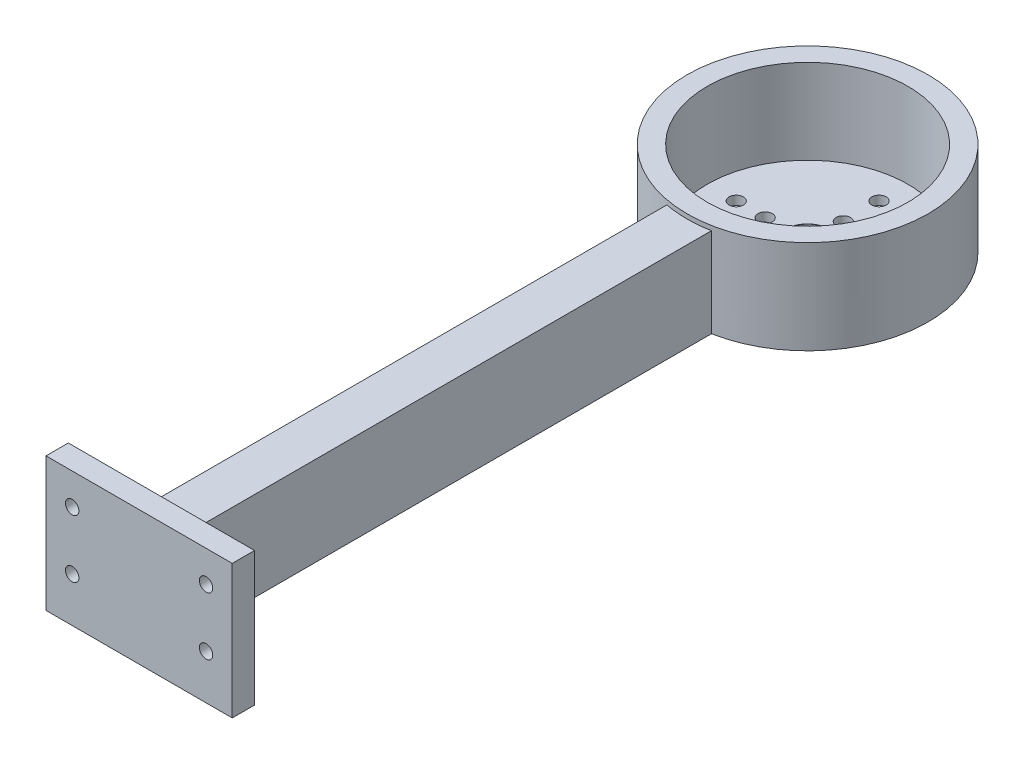
ISO-10303-21;
HEADER;
FILE_DESCRIPTION(('STEP AP214'),'2;1');
FILE_NAME('part.step','',(''),(''),'','','');
FILE_SCHEMA(('AUTOMOTIVE_DESIGN { 1 0 10303 214 1 1 1 1 }'));
ENDSEC;
DATA;
#1=APPLICATION_CONTEXT('core data for automotive mechanical design processes');
#2=APPLICATION_PROTOCOL_DEFINITION('international standard','automotive_design',2000,#1);
#3=PRODUCT_CONTEXT('',#1,'mechanical');
#4=PRODUCT('Part','Part','',(#3));
#5=PRODUCT_RELATED_PRODUCT_CATEGORY('part','',(#4));
#6=PRODUCT_DEFINITION_FORMATION('','',#4);
#7=PRODUCT_DEFINITION_CONTEXT('part definition',#1,'design');
#8=PRODUCT_DEFINITION('design','',#6,#7);
#9=PRODUCT_DEFINITION_SHAPE('','',#8);
#10=(LENGTH_UNIT() NAMED_UNIT(*) SI_UNIT(.MILLI.,.METRE.));
#11=(NAMED_UNIT(*) PLANE_ANGLE_UNIT() SI_UNIT($,.RADIAN.));
#12=(NAMED_UNIT(*) SI_UNIT($,.STERADIAN.) SOLID_ANGLE_UNIT());
#13=UNCERTAINTY_MEASURE_WITH_UNIT(LENGTH_MEASURE(1.E-05),#10,'distance_accuracy_value','');
#14=(GEOMETRIC_REPRESENTATION_CONTEXT(3) GLOBAL_UNCERTAINTY_ASSIGNED_CONTEXT((#13)) GLOBAL_UNIT_ASSIGNED_CONTEXT((#10,
#11,#12)) REPRESENTATION_CONTEXT('',''));
#15=CARTESIAN_POINT('',(0.,0.,0.));
#16=DIRECTION('',(0.,0.,1.));
#17=DIRECTION('',(1.,0.,0.));
#18=AXIS2_PLACEMENT_3D('',#15,#16,#17);
#19=CARTESIAN_POINT('',(0.,0.,0.));
#20=DIRECTION('',(0.,0.,1.));
#21=DIRECTION('',(1.,0.,0.));
#22=AXIS2_PLACEMENT_3D('',#19,#20,#21);
#23=PLANE('',#22);
#24=CARTESIAN_POINT('',(-15.,8.,0.));
#25=DIRECTION('',(0.,0.,-1.));
#26=DIRECTION('',(-1.,0.,0.));
#27=AXIS2_PLACEMENT_3D('',#24,#25,#26);
#28=CIRCLE('',#27,1.525);
#29=CARTESIAN_POINT('',(-16.525,8.,0.));
#30=VERTEX_POINT('',#29);
#31=EDGE_CURVE('E157',#30,#30,#28,.T.);
#32=ORIENTED_EDGE('',*,*,#31,.F.);
#33=EDGE_LOOP('',(#32));
#34=FACE_BOUND('',#33,.T.);
#35=CARTESIAN_POINT('',(15.,8.,0.));
#36=DIRECTION('',(0.,0.,-1.));
#37=DIRECTION('',(-1.,0.,0.));
#38=AXIS2_PLACEMENT_3D('',#35,#36,#37);
#39=CIRCLE('',#38,1.525);
#40=CARTESIAN_POINT('',(13.475,8.,0.));
#41=VERTEX_POINT('',#40);
#42=EDGE_CURVE('E220',#41,#41,#39,.T.);
#43=ORIENTED_EDGE('',*,*,#42,.F.);
#44=EDGE_LOOP('',(#43));
#45=FACE_BOUND('',#44,.T.);
#46=CARTESIAN_POINT('',(-15.,-4.99999999999999,0.));
#47=DIRECTION('',(0.,0.,-1.));
#48=DIRECTION('',(-1.,0.,0.));
#49=AXIS2_PLACEMENT_3D('',#46,#47,#48);
#50=CIRCLE('',#49,1.525);
#51=CARTESIAN_POINT('',(-16.525,-4.99999999999999,0.));
#52=VERTEX_POINT('',#51);
#53=EDGE_CURVE('E229',#52,#52,#50,.T.);
#54=ORIENTED_EDGE('',*,*,#53,.F.);
#55=EDGE_LOOP('',(#54));
#56=FACE_BOUND('',#55,.T.);
#57=CARTESIAN_POINT('',(15.,-5.,0.));
#58=DIRECTION('',(0.,0.,-1.));
#59=DIRECTION('',(-1.,0.,0.));
#60=AXIS2_PLACEMENT_3D('',#57,#58,#59);
#61=CIRCLE('',#60,1.525);
#62=CARTESIAN_POINT('',(13.475,-5.,0.));
#63=VERTEX_POINT('',#62);
#64=EDGE_CURVE('E238',#63,#63,#61,.T.);
#65=ORIENTED_EDGE('',*,*,#64,.F.);
#66=EDGE_LOOP('',(#65));
#67=FACE_BOUND('',#66,.T.);
#68=DIRECTION('',(0.,1.,0.));
#69=VECTOR('',#68,1.);
#70=CARTESIAN_POINT('',(20.865,15.,0.));
#71=LINE('',#70,#69);
#72=CARTESIAN_POINT('',(20.865,-15.,0.));
#73=VERTEX_POINT('',#72);
#74=CARTESIAN_POINT('',(20.865,15.,0.));
#75=VERTEX_POINT('',#74);
#76=EDGE_CURVE('E125',#73,#75,#71,.T.);
#77=ORIENTED_EDGE('',*,*,#76,.F.);
#78=DIRECTION('',(1.,0.,0.));
#79=VECTOR('',#78,1.);
#80=CARTESIAN_POINT('',(-20.865,-15.,0.));
#81=LINE('',#80,#79);
#82=CARTESIAN_POINT('',(-20.865,-15.,0.));
#83=VERTEX_POINT('',#82);
#84=EDGE_CURVE('E130',#83,#73,#81,.T.);
#85=ORIENTED_EDGE('',*,*,#84,.F.);
#86=DIRECTION('',(0.,-1.,0.));
#87=VECTOR('',#86,1.);
#88=CARTESIAN_POINT('',(-20.865,15.,0.));
#89=LINE('',#88,#87);
#90=CARTESIAN_POINT('',(-20.865,15.,0.));
#91=VERTEX_POINT('',#90);
#92=EDGE_CURVE('E141',#91,#83,#89,.T.);
#93=ORIENTED_EDGE('',*,*,#92,.F.);
#94=DIRECTION('',(-1.,0.,0.));
#95=VECTOR('',#94,1.);
#96=CARTESIAN_POINT('',(-20.865,15.,0.));
#97=LINE('',#96,#95);
#98=EDGE_CURVE('E139',#75,#91,#97,.T.);
#99=ORIENTED_EDGE('',*,*,#98,.F.);
#100=EDGE_LOOP('',(#77,#85,#93,#99));
#101=FACE_BOUND('',#100,.T.);
#102=DIRECTION('',(0.,1.,0.));
#103=VECTOR('',#102,1.);
#104=CARTESIAN_POINT('',(-5.,10.,0.));
#105=LINE('',#104,#103);
#106=CARTESIAN_POINT('',(-5.,-10.,0.));
#107=VERTEX_POINT('',#106);
#108=CARTESIAN_POINT('',(-5.,10.,0.));
#109=VERTEX_POINT('',#108);
#110=EDGE_CURVE('E257',#107,#109,#105,.T.);
#111=ORIENTED_EDGE('',*,*,#110,.F.);
#112=DIRECTION('',(-1.,0.,0.));
#113=VECTOR('',#112,1.);
#114=CARTESIAN_POINT('',(5.,-10.,0.));
#115=LINE('',#114,#113);
#116=CARTESIAN_POINT('',(5.,-10.,0.));
#117=VERTEX_POINT('',#116);
#118=EDGE_CURVE('E120',#117,#107,#115,.T.);
#119=ORIENTED_EDGE('',*,*,#118,.F.);
#120=DIRECTION('',(0.,-1.,0.));
#121=VECTOR('',#120,1.);
#122=CARTESIAN_POINT('',(5.,10.,0.));
#123=LINE('',#122,#121);
#124=CARTESIAN_POINT('',(5.,10.,0.));
#125=VERTEX_POINT('',#124);
#126=EDGE_CURVE('E115',#125,#117,#123,.T.);
#127=ORIENTED_EDGE('',*,*,#126,.F.);
#128=DIRECTION('',(1.,0.,0.));
#129=VECTOR('',#128,1.);
#130=CARTESIAN_POINT('',(5.,10.,0.));
#131=LINE('',#130,#129);
#132=EDGE_CURVE('E260',#109,#125,#131,.T.);
#133=ORIENTED_EDGE('',*,*,#132,.F.);
#134=EDGE_LOOP('',(#111,#119,#127,#133));
#135=FACE_BOUND('',#134,.T.);
#136=ADVANCED_FACE('F33',(#34,#45,#56,#67,#101,#135),#23,.F.);
#137=CARTESIAN_POINT('',(20.865,15.,5.));
#138=DIRECTION('',(-1.,0.,0.));
#139=DIRECTION('',(0.,-1.,0.));
#140=AXIS2_PLACEMENT_3D('',#137,#138,#139);
#141=PLANE('',#140);
#142=ORIENTED_EDGE('',*,*,#76,.T.);
#143=DIRECTION('',(0.,0.,-1.));
#144=VECTOR('',#143,1.);
#145=CARTESIAN_POINT('',(20.865,15.,5.));
#146=LINE('',#145,#144);
#147=CARTESIAN_POINT('',(20.865,15.,5.));
#148=VERTEX_POINT('',#147);
#149=EDGE_CURVE('E42',#148,#75,#146,.T.);
#150=ORIENTED_EDGE('',*,*,#149,.F.);
#151=DIRECTION('',(0.,1.,0.));
#152=VECTOR('',#151,1.);
#153=CARTESIAN_POINT('',(20.865,15.,5.));
#154=LINE('',#153,#152);
#155=CARTESIAN_POINT('',(20.865,-15.,5.));
#156=VERTEX_POINT('',#155);
#157=EDGE_CURVE('E126',#156,#148,#154,.T.);
#158=ORIENTED_EDGE('',*,*,#157,.F.);
#159=DIRECTION('',(0.,0.,-1.));
#160=VECTOR('',#159,1.);
#161=CARTESIAN_POINT('',(20.865,-15.,5.));
#162=LINE('',#161,#160);
#163=EDGE_CURVE('E136',#156,#73,#162,.T.);
#164=ORIENTED_EDGE('',*,*,#163,.T.);
#165=EDGE_LOOP('',(#142,#150,#158,#164));
#166=FACE_BOUND('',#165,.T.);
#167=ADVANCED_FACE('F35',(#166),#141,.F.);
#168=CARTESIAN_POINT('',(-20.865,15.,5.));
#169=DIRECTION('',(0.,-1.,0.));
#170=DIRECTION('',(0.,0.,-1.));
#171=AXIS2_PLACEMENT_3D('',#168,#169,#170);
#172=PLANE('',#171);
#173=ORIENTED_EDGE('',*,*,#98,.T.);
#174=DIRECTION('',(0.,0.,-1.));
#175=VECTOR('',#174,1.);
#176=CARTESIAN_POINT('',(-20.865,15.,5.));
#177=LINE('',#176,#175);
#178=CARTESIAN_POINT('',(-20.865,15.,5.));
#179=VERTEX_POINT('',#178);
#180=EDGE_CURVE('E149',#179,#91,#177,.T.);
#181=ORIENTED_EDGE('',*,*,#180,.F.);
#182=DIRECTION('',(-1.,0.,0.));
#183=VECTOR('',#182,1.);
#184=CARTESIAN_POINT('',(-20.865,15.,5.));
#185=LINE('',#184,#183);
#186=EDGE_CURVE('E129',#148,#179,#185,.T.);
#187=ORIENTED_EDGE('',*,*,#186,.F.);
#188=ORIENTED_EDGE('',*,*,#149,.T.);
#189=EDGE_LOOP('',(#173,#181,#187,#188));
#190=FACE_BOUND('',#189,.T.);
#191=ADVANCED_FACE('F284',(#190),#172,.F.);
#192=CARTESIAN_POINT('',(-20.865,15.,5.));
#193=DIRECTION('',(1.,0.,0.));
#194=DIRECTION('',(0.,1.,0.));
#195=AXIS2_PLACEMENT_3D('',#192,#193,#194);
#196=PLANE('',#195);
#197=ORIENTED_EDGE('',*,*,#92,.T.);
#198=DIRECTION('',(0.,0.,-1.));
#199=VECTOR('',#198,1.);
#200=CARTESIAN_POINT('',(-20.865,-15.,5.));
#201=LINE('',#200,#199);
#202=CARTESIAN_POINT('',(-20.865,-15.,5.));
#203=VERTEX_POINT('',#202);
#204=EDGE_CURVE('E146',#203,#83,#201,.T.);
#205=ORIENTED_EDGE('',*,*,#204,.F.);
#206=DIRECTION('',(0.,-1.,0.));
#207=VECTOR('',#206,1.);
#208=CARTESIAN_POINT('',(-20.865,15.,5.));
#209=LINE('',#208,#207);
#210=EDGE_CURVE('E132',#179,#203,#209,.T.);
#211=ORIENTED_EDGE('',*,*,#210,.F.);
#212=ORIENTED_EDGE('',*,*,#180,.T.);
#213=EDGE_LOOP('',(#197,#205,#211,#212));
#214=FACE_BOUND('',#213,.T.);
#215=ADVANCED_FACE('F293',(#214),#196,.F.);
#216=CARTESIAN_POINT('',(-20.865,-15.,5.));
#217=DIRECTION('',(0.,1.,0.));
#218=DIRECTION('',(0.,0.,1.));
#219=AXIS2_PLACEMENT_3D('',#216,#217,#218);
#220=PLANE('',#219);
#221=ORIENTED_EDGE('',*,*,#84,.T.);
#222=ORIENTED_EDGE('',*,*,#163,.F.);
#223=DIRECTION('',(1.,0.,0.));
#224=VECTOR('',#223,1.);
#225=CARTESIAN_POINT('',(-20.865,-15.,5.));
#226=LINE('',#225,#224);
#227=EDGE_CURVE('E134',#203,#156,#226,.T.);
#228=ORIENTED_EDGE('',*,*,#227,.F.);
#229=ORIENTED_EDGE('',*,*,#204,.T.);
#230=EDGE_LOOP('',(#221,#222,#228,#229));
#231=FACE_BOUND('',#230,.T.);
#232=ADVANCED_FACE('F290',(#231),#220,.F.);
#233=CARTESIAN_POINT('',(0.,0.,5.));
#234=DIRECTION('',(0.,0.,1.));
#235=DIRECTION('',(1.,0.,0.));
#236=AXIS2_PLACEMENT_3D('',#233,#234,#235);
#237=PLANE('',#236);
#238=CARTESIAN_POINT('',(-15.,8.,5.));
#239=DIRECTION('',(0.,0.,-1.));
#240=DIRECTION('',(-1.,0.,0.));
#241=AXIS2_PLACEMENT_3D('',#238,#239,#240);
#242=CIRCLE('',#241,1.5);
#243=CARTESIAN_POINT('',(-16.5,8.,5.));
#244=VERTEX_POINT('',#243);
#245=EDGE_CURVE('E217',#244,#244,#242,.T.);
#246=ORIENTED_EDGE('',*,*,#245,.T.);
#247=EDGE_LOOP('',(#246));
#248=FACE_BOUND('',#247,.T.);
#249=CARTESIAN_POINT('',(15.,8.,5.));
#250=DIRECTION('',(0.,0.,-1.));
#251=DIRECTION('',(-1.,0.,0.));
#252=AXIS2_PLACEMENT_3D('',#249,#250,#251);
#253=CIRCLE('',#252,1.5);
#254=CARTESIAN_POINT('',(13.5,8.,5.));
#255=VERTEX_POINT('',#254);
#256=EDGE_CURVE('E226',#255,#255,#253,.T.);
#257=ORIENTED_EDGE('',*,*,#256,.T.);
#258=EDGE_LOOP('',(#257));
#259=FACE_BOUND('',#258,.T.);
#260=CARTESIAN_POINT('',(-15.,-4.99999999999999,5.));
#261=DIRECTION('',(0.,0.,-1.));
#262=DIRECTION('',(-1.,0.,0.));
#263=AXIS2_PLACEMENT_3D('',#260,#261,#262);
#264=CIRCLE('',#263,1.5);
#265=CARTESIAN_POINT('',(-16.5,-4.99999999999999,5.));
#266=VERTEX_POINT('',#265);
#267=EDGE_CURVE('E235',#266,#266,#264,.T.);
#268=ORIENTED_EDGE('',*,*,#267,.T.);
#269=EDGE_LOOP('',(#268));
#270=FACE_BOUND('',#269,.T.);
#271=CARTESIAN_POINT('',(15.,-5.,5.));
#272=DIRECTION('',(0.,0.,-1.));
#273=DIRECTION('',(-1.,0.,0.));
#274=AXIS2_PLACEMENT_3D('',#271,#272,#273);
#275=CIRCLE('',#274,1.5);
#276=CARTESIAN_POINT('',(13.5,-5.,5.));
#277=VERTEX_POINT('',#276);
#278=EDGE_CURVE('E244',#277,#277,#275,.T.);
#279=ORIENTED_EDGE('',*,*,#278,.T.);
#280=EDGE_LOOP('',(#279));
#281=FACE_BOUND('',#280,.T.);
#282=ORIENTED_EDGE('',*,*,#157,.T.);
#283=ORIENTED_EDGE('',*,*,#186,.T.);
#284=ORIENTED_EDGE('',*,*,#210,.T.);
#285=ORIENTED_EDGE('',*,*,#227,.T.);
#286=EDGE_LOOP('',(#282,#283,#284,#285));
#287=FACE_BOUND('',#286,.T.);
#288=ADVANCED_FACE('F276',(#248,#259,#270,#281,#287),#237,.T.);
#289=CARTESIAN_POINT('',(-5.,10.,-144.78));
#290=DIRECTION('',(1.,0.,0.));
#291=DIRECTION('',(0.,1.,0.));
#292=AXIS2_PLACEMENT_3D('',#289,#290,#291);
#293=PLANE('',#292);
#294=DIRECTION('',(0.,1.,0.));
#295=VECTOR('',#294,1.);
#296=CARTESIAN_POINT('',(-5.,2.,-118.247001677157));
#297=LINE('',#296,#295);
#298=CARTESIAN_POINT('',(-5.,10.,-118.247001677157));
#299=VERTEX_POINT('',#298);
#300=CARTESIAN_POINT('',(-5.,-10.,-118.247001677157));
#301=VERTEX_POINT('',#300);
#302=EDGE_CURVE('E255',#299,#301,#297,.F.);
#303=ORIENTED_EDGE('',*,*,#302,.T.);
#304=DIRECTION('',(0.,0.,1.));
#305=VECTOR('',#304,1.);
#306=CARTESIAN_POINT('',(-5.,-10.,-144.78));
#307=LINE('',#306,#305);
#308=EDGE_CURVE('E108',#301,#107,#307,.T.);
#309=ORIENTED_EDGE('',*,*,#308,.T.);
#310=ORIENTED_EDGE('',*,*,#110,.T.);
#311=DIRECTION('',(0.,0.,1.));
#312=VECTOR('',#311,1.);
#313=CARTESIAN_POINT('',(-5.,10.,-144.78));
#314=LINE('',#313,#312);
#315=EDGE_CURVE('E118',#299,#109,#314,.T.);
#316=ORIENTED_EDGE('',*,*,#315,.F.);
#317=EDGE_LOOP('',(#303,#309,#310,#316));
#318=FACE_BOUND('',#317,.T.);
#319=ADVANCED_FACE('F267',(#318),#293,.F.);
#320=CARTESIAN_POINT('',(5.,10.,-144.78));
#321=DIRECTION('',(0.,-1.,0.));
#322=DIRECTION('',(0.,0.,-1.));
#323=AXIS2_PLACEMENT_3D('',#320,#321,#322);
#324=PLANE('',#323);
#325=DIRECTION('',(0.,0.,1.));
#326=VECTOR('',#325,1.);
#327=CARTESIAN_POINT('',(5.,10.,-144.78));
#328=LINE('',#327,#326);
#329=CARTESIAN_POINT('',(5.,10.,-118.247001677157));
#330=VERTEX_POINT('',#329);
#331=EDGE_CURVE('E116',#330,#125,#328,.T.);
#332=ORIENTED_EDGE('',*,*,#331,.F.);
#333=CARTESIAN_POINT('',(0.,10.,-144.78));
#334=DIRECTION('',(0.,-1.,0.));
#335=DIRECTION('',(0.,0.,-1.));
#336=AXIS2_PLACEMENT_3D('',#333,#334,#335);
#337=CIRCLE('',#336,27.);
#338=EDGE_CURVE('E50',#330,#299,#337,.T.);
#339=ORIENTED_EDGE('',*,*,#338,.T.);
#340=ORIENTED_EDGE('',*,*,#315,.T.);
#341=ORIENTED_EDGE('',*,*,#132,.T.);
#342=EDGE_LOOP('',(#332,#339,#340,#341));
#343=FACE_BOUND('',#342,.T.);
#344=ADVANCED_FACE('F268',(#343),#324,.F.);
#345=CARTESIAN_POINT('',(5.,10.,-144.78));
#346=DIRECTION('',(-1.,0.,0.));
#347=DIRECTION('',(0.,-1.,0.));
#348=AXIS2_PLACEMENT_3D('',#345,#346,#347);
#349=PLANE('',#348);
#350=DIRECTION('',(0.,0.,1.));
#351=VECTOR('',#350,1.);
#352=CARTESIAN_POINT('',(5.,-10.,-144.78));
#353=LINE('',#352,#351);
#354=CARTESIAN_POINT('',(5.,-10.,-118.247001677157));
#355=VERTEX_POINT('',#354);
#356=EDGE_CURVE('E106',#355,#117,#353,.T.);
#357=ORIENTED_EDGE('',*,*,#356,.F.);
#358=DIRECTION('',(0.,1.,0.));
#359=VECTOR('',#358,1.);
#360=CARTESIAN_POINT('',(5.,2.,-118.247001677157));
#361=LINE('',#360,#359);
#362=EDGE_CURVE('E11',#355,#330,#361,.T.);
#363=ORIENTED_EDGE('',*,*,#362,.T.);
#364=ORIENTED_EDGE('',*,*,#331,.T.);
#365=ORIENTED_EDGE('',*,*,#126,.T.);
#366=EDGE_LOOP('',(#357,#363,#364,#365));
#367=FACE_BOUND('',#366,.T.);
#368=ADVANCED_FACE('F113',(#367),#349,.F.);
#369=CARTESIAN_POINT('',(5.,-10.,-144.78));
#370=DIRECTION('',(0.,1.,0.));
#371=DIRECTION('',(0.,0.,1.));
#372=AXIS2_PLACEMENT_3D('',#369,#370,#371);
#373=PLANE('',#372);
#374=CARTESIAN_POINT('',(0.,-10.,-128.78));
#375=DIRECTION('',(0.,1.,0.));
#376=DIRECTION('',(0.,0.,1.));
#377=AXIS2_PLACEMENT_3D('',#374,#375,#376);
#378=CIRCLE('',#377,1.59999999999999);
#379=CARTESIAN_POINT('',(0.,-10.,-127.18));
#380=VERTEX_POINT('',#379);
#381=EDGE_CURVE('E37',#380,#380,#378,.T.);
#382=ORIENTED_EDGE('',*,*,#381,.T.);
#383=EDGE_LOOP('',(#382));
#384=FACE_BOUND('',#383,.T.);
#385=CARTESIAN_POINT('',(0.,-10.,-136.78));
#386=DIRECTION('',(0.,1.,0.));
#387=DIRECTION('',(0.,0.,1.));
#388=AXIS2_PLACEMENT_3D('',#385,#386,#387);
#389=CIRCLE('',#388,1.59999999999999);
#390=CARTESIAN_POINT('',(0.,-10.,-135.18));
#391=VERTEX_POINT('',#390);
#392=EDGE_CURVE('E183',#391,#391,#389,.T.);
#393=ORIENTED_EDGE('',*,*,#392,.T.);
#394=EDGE_LOOP('',(#393));
#395=FACE_BOUND('',#394,.T.);
#396=CARTESIAN_POINT('',(16.,-10.,-144.78));
#397=DIRECTION('',(0.,1.,0.));
#398=DIRECTION('',(0.,0.,1.));
#399=AXIS2_PLACEMENT_3D('',#396,#397,#398);
#400=CIRCLE('',#399,1.59999999999999);
#401=CARTESIAN_POINT('',(16.,-10.,-143.18));
#402=VERTEX_POINT('',#401);
#403=EDGE_CURVE('E180',#402,#402,#400,.T.);
#404=ORIENTED_EDGE('',*,*,#403,.T.);
#405=EDGE_LOOP('',(#404));
#406=FACE_BOUND('',#405,.T.);
#407=CARTESIAN_POINT('',(9.5,-10.,-144.78));
#408=DIRECTION('',(0.,1.,0.));
#409=DIRECTION('',(0.,0.,1.));
#410=AXIS2_PLACEMENT_3D('',#407,#408,#409);
#411=CIRCLE('',#410,1.59999999999999);
#412=CARTESIAN_POINT('',(9.5,-10.,-143.18));
#413=VERTEX_POINT('',#412);
#414=EDGE_CURVE('E176',#413,#413,#411,.T.);
#415=ORIENTED_EDGE('',*,*,#414,.T.);
#416=EDGE_LOOP('',(#415));
#417=FACE_BOUND('',#416,.T.);
#418=CARTESIAN_POINT('',(0.,-10.,-160.78));
#419=DIRECTION('',(0.,1.,0.));
#420=DIRECTION('',(0.,0.,1.));
#421=AXIS2_PLACEMENT_3D('',#418,#419,#420);
#422=CIRCLE('',#421,1.59999999999999);
#423=CARTESIAN_POINT('',(0.,-10.,-159.18));
#424=VERTEX_POINT('',#423);
#425=EDGE_CURVE('E172',#424,#424,#422,.T.);
#426=ORIENTED_EDGE('',*,*,#425,.T.);
#427=EDGE_LOOP('',(#426));
#428=FACE_BOUND('',#427,.T.);
#429=CARTESIAN_POINT('',(0.,-10.,-152.78));
#430=DIRECTION('',(0.,1.,0.));
#431=DIRECTION('',(0.,0.,1.));
#432=AXIS2_PLACEMENT_3D('',#429,#430,#431);
#433=CIRCLE('',#432,1.59999999999999);
#434=CARTESIAN_POINT('',(0.,-10.,-151.18));
#435=VERTEX_POINT('',#434);
#436=EDGE_CURVE('E168',#435,#435,#433,.T.);
#437=ORIENTED_EDGE('',*,*,#436,.T.);
#438=EDGE_LOOP('',(#437));
#439=FACE_BOUND('',#438,.T.);
#440=CARTESIAN_POINT('',(-16.,-10.,-144.78));
#441=DIRECTION('',(0.,1.,0.));
#442=DIRECTION('',(0.,0.,1.));
#443=AXIS2_PLACEMENT_3D('',#440,#441,#442);
#444=CIRCLE('',#443,1.59999999999999);
#445=CARTESIAN_POINT('',(-16.,-10.,-143.18));
#446=VERTEX_POINT('',#445);
#447=EDGE_CURVE('E164',#446,#446,#444,.T.);
#448=ORIENTED_EDGE('',*,*,#447,.T.);
#449=EDGE_LOOP('',(#448));
#450=FACE_BOUND('',#449,.T.);
#451=CARTESIAN_POINT('',(-9.5,-10.,-144.78));
#452=DIRECTION('',(0.,1.,0.));
#453=DIRECTION('',(0.,0.,1.));
#454=AXIS2_PLACEMENT_3D('',#451,#452,#453);
#455=CIRCLE('',#454,1.59999999999999);
#456=CARTESIAN_POINT('',(-9.5,-10.,-143.18));
#457=VERTEX_POINT('',#456);
#458=EDGE_CURVE('E159',#457,#457,#455,.T.);
#459=ORIENTED_EDGE('',*,*,#458,.T.);
#460=EDGE_LOOP('',(#459));
#461=FACE_BOUND('',#460,.T.);
#462=CARTESIAN_POINT('',(0.,-10.,-144.78));
#463=DIRECTION('',(0.,1.,0.));
#464=DIRECTION('',(0.,0.,1.));
#465=AXIS2_PLACEMENT_3D('',#462,#463,#464);
#466=CIRCLE('',#465,5.);
#467=CARTESIAN_POINT('',(0.,-10.,-139.78));
#468=VERTEX_POINT('',#467);
#469=EDGE_CURVE('E154',#468,#468,#466,.T.);
#470=ORIENTED_EDGE('',*,*,#469,.T.);
#471=EDGE_LOOP('',(#470));
#472=FACE_BOUND('',#471,.T.);
#473=ORIENTED_EDGE('',*,*,#308,.F.);
#474=CARTESIAN_POINT('',(0.,-10.,-144.78));
#475=DIRECTION('',(0.,1.,0.));
#476=DIRECTION('',(0.,0.,1.));
#477=AXIS2_PLACEMENT_3D('',#474,#475,#476);
#478=CIRCLE('',#477,27.);
#479=EDGE_CURVE('E101',#355,#301,#478,.T.);
#480=ORIENTED_EDGE('',*,*,#479,.F.);
#481=ORIENTED_EDGE('',*,*,#356,.T.);
#482=ORIENTED_EDGE('',*,*,#118,.T.);
#483=EDGE_LOOP('',(#473,#480,#481,#482));
#484=FACE_BOUND('',#483,.T.);
#485=ADVANCED_FACE('F104',(#384,#395,#406,#417,#428,#439,#450,#461,#472,#484),#373,.F.);
#486=CARTESIAN_POINT('',(0.,2.,-144.78));
#487=DIRECTION('',(0.,1.,0.));
#488=DIRECTION('',(0.,0.,1.));
#489=AXIS2_PLACEMENT_3D('',#486,#487,#488);
#490=CYLINDRICAL_SURFACE('',#489,27.);
#491=ORIENTED_EDGE('',*,*,#338,.F.);
#492=ORIENTED_EDGE('',*,*,#362,.F.);
#493=ORIENTED_EDGE('',*,*,#479,.T.);
#494=ORIENTED_EDGE('',*,*,#302,.F.);
#495=EDGE_LOOP('',(#491,#492,#493,#494));
#496=FACE_BOUND('',#495,.T.);
#497=CARTESIAN_POINT('',(0.,11.,-144.78));
#498=DIRECTION('',(0.,1.,0.));
#499=DIRECTION('',(0.,0.,1.));
#500=AXIS2_PLACEMENT_3D('',#497,#498,#499);
#501=CIRCLE('',#500,27.);
#502=CARTESIAN_POINT('',(0.,11.,-117.78));
#503=VERTEX_POINT('',#502);
#504=EDGE_CURVE('E251',#503,#503,#501,.T.);
#505=ORIENTED_EDGE('',*,*,#504,.F.);
#506=EDGE_LOOP('',(#505));
#507=FACE_BOUND('',#506,.T.);
#508=ADVANCED_FACE('F98',(#496,#507),#490,.T.);
#509=CARTESIAN_POINT('',(0.,2.,-144.78));
#510=DIRECTION('',(0.,1.,0.));
#511=DIRECTION('',(0.,0.,1.));
#512=AXIS2_PLACEMENT_3D('',#509,#510,#511);
#513=CYLINDRICAL_SURFACE('',#512,22.5);
#514=CARTESIAN_POINT('',(0.,11.,-144.78));
#515=DIRECTION('',(0.,1.,0.));
#516=DIRECTION('',(0.,0.,1.));
#517=AXIS2_PLACEMENT_3D('',#514,#515,#516);
#518=CIRCLE('',#517,22.5);
#519=CARTESIAN_POINT('',(0.,11.,-122.28));
#520=VERTEX_POINT('',#519);
#521=EDGE_CURVE('E109',#520,#520,#518,.T.);
#522=ORIENTED_EDGE('',*,*,#521,.T.);
#523=EDGE_LOOP('',(#522));
#524=FACE_BOUND('',#523,.T.);
#525=CARTESIAN_POINT('',(0.,-8.,-144.78));
#526=DIRECTION('',(0.,1.,0.));
#527=DIRECTION('',(0.,0.,1.));
#528=AXIS2_PLACEMENT_3D('',#525,#526,#527);
#529=CIRCLE('',#528,22.5);
#530=CARTESIAN_POINT('',(0.,-8.,-122.28));
#531=VERTEX_POINT('',#530);
#532=EDGE_CURVE('E110',#531,#531,#529,.T.);
#533=ORIENTED_EDGE('',*,*,#532,.F.);
#534=EDGE_LOOP('',(#533));
#535=FACE_BOUND('',#534,.T.);
#536=ADVANCED_FACE('F353',(#524,#535),#513,.F.);
#537=CARTESIAN_POINT('',(0.,11.,-144.78));
#538=DIRECTION('',(0.,1.,0.));
#539=DIRECTION('',(0.,0.,1.));
#540=AXIS2_PLACEMENT_3D('',#537,#538,#539);
#541=PLANE('',#540);
#542=ORIENTED_EDGE('',*,*,#504,.T.);
#543=EDGE_LOOP('',(#542));
#544=FACE_BOUND('',#543,.T.);
#545=ORIENTED_EDGE('',*,*,#521,.F.);
#546=EDGE_LOOP('',(#545));
#547=FACE_BOUND('',#546,.T.);
#548=ADVANCED_FACE('F349',(#544,#547),#541,.T.);
#549=CARTESIAN_POINT('',(0.,-8.,-144.78));
#550=DIRECTION('',(0.,1.,0.));
#551=DIRECTION('',(0.,0.,1.));
#552=AXIS2_PLACEMENT_3D('',#549,#550,#551);
#553=PLANE('',#552);
#554=CARTESIAN_POINT('',(0.,-8.,-128.78));
#555=DIRECTION('',(0.,1.,0.));
#556=DIRECTION('',(0.,0.,1.));
#557=AXIS2_PLACEMENT_3D('',#554,#555,#556);
#558=CIRCLE('',#557,1.59999999999999);
#559=CARTESIAN_POINT('',(0.,-8.,-127.18));
#560=VERTEX_POINT('',#559);
#561=EDGE_CURVE('E195',#560,#560,#558,.T.);
#562=ORIENTED_EDGE('',*,*,#561,.F.);
#563=EDGE_LOOP('',(#562));
#564=FACE_BOUND('',#563,.T.);
#565=CARTESIAN_POINT('',(0.,-8.,-136.78));
#566=DIRECTION('',(0.,1.,0.));
#567=DIRECTION('',(0.,0.,1.));
#568=AXIS2_PLACEMENT_3D('',#565,#566,#567);
#569=CIRCLE('',#568,1.59999999999999);
#570=CARTESIAN_POINT('',(0.,-8.,-135.18));
#571=VERTEX_POINT('',#570);
#572=EDGE_CURVE('E185',#571,#571,#569,.T.);
#573=ORIENTED_EDGE('',*,*,#572,.F.);
#574=EDGE_LOOP('',(#573));
#575=FACE_BOUND('',#574,.T.);
#576=CARTESIAN_POINT('',(16.,-8.,-144.78));
#577=DIRECTION('',(0.,1.,0.));
#578=DIRECTION('',(0.,0.,1.));
#579=AXIS2_PLACEMENT_3D('',#576,#577,#578);
#580=CIRCLE('',#579,1.59999999999999);
#581=CARTESIAN_POINT('',(16.,-8.,-143.18));
#582=VERTEX_POINT('',#581);
#583=EDGE_CURVE('E182',#582,#582,#580,.T.);
#584=ORIENTED_EDGE('',*,*,#583,.F.);
#585=EDGE_LOOP('',(#584));
#586=FACE_BOUND('',#585,.T.);
#587=CARTESIAN_POINT('',(9.5,-8.,-144.78));
#588=DIRECTION('',(0.,1.,0.));
#589=DIRECTION('',(0.,0.,1.));
#590=AXIS2_PLACEMENT_3D('',#587,#588,#589);
#591=CIRCLE('',#590,1.59999999999999);
#592=CARTESIAN_POINT('',(9.5,-8.,-143.18));
#593=VERTEX_POINT('',#592);
#594=EDGE_CURVE('E179',#593,#593,#591,.T.);
#595=ORIENTED_EDGE('',*,*,#594,.F.);
#596=EDGE_LOOP('',(#595));
#597=FACE_BOUND('',#596,.T.);
#598=CARTESIAN_POINT('',(0.,-8.,-160.78));
#599=DIRECTION('',(0.,1.,0.));
#600=DIRECTION('',(0.,0.,1.));
#601=AXIS2_PLACEMENT_3D('',#598,#599,#600);
#602=CIRCLE('',#601,1.59999999999999);
#603=CARTESIAN_POINT('',(0.,-8.,-159.18));
#604=VERTEX_POINT('',#603);
#605=EDGE_CURVE('E175',#604,#604,#602,.T.);
#606=ORIENTED_EDGE('',*,*,#605,.F.);
#607=EDGE_LOOP('',(#606));
#608=FACE_BOUND('',#607,.T.);
#609=CARTESIAN_POINT('',(0.,-8.,-152.78));
#610=DIRECTION('',(0.,1.,0.));
#611=DIRECTION('',(0.,0.,1.));
#612=AXIS2_PLACEMENT_3D('',#609,#610,#611);
#613=CIRCLE('',#612,1.59999999999999);
#614=CARTESIAN_POINT('',(0.,-8.,-151.18));
#615=VERTEX_POINT('',#614);
#616=EDGE_CURVE('E171',#615,#615,#613,.T.);
#617=ORIENTED_EDGE('',*,*,#616,.F.);
#618=EDGE_LOOP('',(#617));
#619=FACE_BOUND('',#618,.T.);
#620=CARTESIAN_POINT('',(-16.,-8.,-144.78));
#621=DIRECTION('',(0.,1.,0.));
#622=DIRECTION('',(0.,0.,1.));
#623=AXIS2_PLACEMENT_3D('',#620,#621,#622);
#624=CIRCLE('',#623,1.59999999999999);
#625=CARTESIAN_POINT('',(-16.,-8.,-143.18));
#626=VERTEX_POINT('',#625);
#627=EDGE_CURVE('E167',#626,#626,#624,.T.);
#628=ORIENTED_EDGE('',*,*,#627,.F.);
#629=EDGE_LOOP('',(#628));
#630=FACE_BOUND('',#629,.T.);
#631=CARTESIAN_POINT('',(-9.5,-8.,-144.78));
#632=DIRECTION('',(0.,1.,0.));
#633=DIRECTION('',(0.,0.,1.));
#634=AXIS2_PLACEMENT_3D('',#631,#632,#633);
#635=CIRCLE('',#634,1.59999999999999);
#636=CARTESIAN_POINT('',(-9.5,-8.,-143.18));
#637=VERTEX_POINT('',#636);
#638=EDGE_CURVE('E163',#637,#637,#635,.T.);
#639=ORIENTED_EDGE('',*,*,#638,.F.);
#640=EDGE_LOOP('',(#639));
#641=FACE_BOUND('',#640,.T.);
#642=CARTESIAN_POINT('',(0.,-8.,-144.78));
#643=DIRECTION('',(0.,1.,0.));
#644=DIRECTION('',(0.,0.,1.));
#645=AXIS2_PLACEMENT_3D('',#642,#643,#644);
#646=CIRCLE('',#645,5.025);
#647=CARTESIAN_POINT('',(0.,-8.,-139.755));
#648=VERTEX_POINT('',#647);
#649=EDGE_CURVE('E162',#648,#648,#646,.T.);
#650=ORIENTED_EDGE('',*,*,#649,.F.);
#651=EDGE_LOOP('',(#650));
#652=FACE_BOUND('',#651,.T.);
#653=ORIENTED_EDGE('',*,*,#532,.T.);
#654=EDGE_LOOP('',(#653));
#655=FACE_BOUND('',#654,.T.);
#656=ADVANCED_FACE('F329',(#564,#575,#586,#597,#608,#619,#630,#641,#652,#655),#553,.T.);
#657=CARTESIAN_POINT('',(15.,-5.,0.));
#658=DIRECTION('',(0.,0.,-1.));
#659=DIRECTION('',(-1.,0.,0.));
#660=AXIS2_PLACEMENT_3D('',#657,#658,#659);
#661=CYLINDRICAL_SURFACE('',#660,1.5);
#662=ORIENTED_EDGE('',*,*,#278,.F.);
#663=EDGE_LOOP('',(#662));
#664=FACE_BOUND('',#663,.T.);
#665=CARTESIAN_POINT('',(15.,-5.,0.024999999999999));
#666=DIRECTION('',(0.,0.,-1.));
#667=DIRECTION('',(-1.,0.,0.));
#668=AXIS2_PLACEMENT_3D('',#665,#666,#667);
#669=CIRCLE('',#668,1.5);
#670=CARTESIAN_POINT('',(13.5,-5.,0.024999999999999));
#671=VERTEX_POINT('',#670);
#672=EDGE_CURVE('E241',#671,#671,#669,.T.);
#673=ORIENTED_EDGE('',*,*,#672,.T.);
#674=EDGE_LOOP('',(#673));
#675=FACE_BOUND('',#674,.T.);
#676=ADVANCED_FACE('F325',(#664,#675),#661,.F.);
#677=CARTESIAN_POINT('',(15.,-5.,0.));
#678=DIRECTION('',(0.,0.,-1.));
#679=DIRECTION('',(-1.,0.,0.));
#680=AXIS2_PLACEMENT_3D('',#677,#678,#679);
#681=CONICAL_SURFACE('',#680,1.525,0.785398163397483);
#682=ORIENTED_EDGE('',*,*,#672,.F.);
#683=EDGE_LOOP('',(#682));
#684=FACE_BOUND('',#683,.T.);
#685=ORIENTED_EDGE('',*,*,#64,.T.);
#686=EDGE_LOOP('',(#685));
#687=FACE_BOUND('',#686,.T.);
#688=ADVANCED_FACE('F328',(#684,#687),#681,.F.);
#689=CARTESIAN_POINT('',(-15.,-4.99999999999999,0.));
#690=DIRECTION('',(0.,0.,-1.));
#691=DIRECTION('',(-1.,0.,0.));
#692=AXIS2_PLACEMENT_3D('',#689,#690,#691);
#693=CYLINDRICAL_SURFACE('',#692,1.5);
#694=ORIENTED_EDGE('',*,*,#267,.F.);
#695=EDGE_LOOP('',(#694));
#696=FACE_BOUND('',#695,.T.);
#697=CARTESIAN_POINT('',(-15.,-4.99999999999999,0.024999999999999));
#698=DIRECTION('',(0.,0.,-1.));
#699=DIRECTION('',(-1.,0.,0.));
#700=AXIS2_PLACEMENT_3D('',#697,#698,#699);
#701=CIRCLE('',#700,1.5);
#702=CARTESIAN_POINT('',(-16.5,-4.99999999999999,0.024999999999999));
#703=VERTEX_POINT('',#702);
#704=EDGE_CURVE('E232',#703,#703,#701,.T.);
#705=ORIENTED_EDGE('',*,*,#704,.T.);
#706=EDGE_LOOP('',(#705));
#707=FACE_BOUND('',#706,.T.);
#708=ADVANCED_FACE('F335',(#696,#707),#693,.F.);
#709=CARTESIAN_POINT('',(-15.,-4.99999999999999,0.));
#710=DIRECTION('',(0.,0.,-1.));
#711=DIRECTION('',(-1.,0.,0.));
#712=AXIS2_PLACEMENT_3D('',#709,#710,#711);
#713=CONICAL_SURFACE('',#712,1.525,0.785398163397483);
#714=ORIENTED_EDGE('',*,*,#704,.F.);
#715=EDGE_LOOP('',(#714));
#716=FACE_BOUND('',#715,.T.);
#717=ORIENTED_EDGE('',*,*,#53,.T.);
#718=EDGE_LOOP('',(#717));
#719=FACE_BOUND('',#718,.T.);
#720=ADVANCED_FACE('F342',(#716,#719),#713,.F.);
#721=CARTESIAN_POINT('',(15.,8.,0.));
#722=DIRECTION('',(0.,0.,-1.));
#723=DIRECTION('',(-1.,0.,0.));
#724=AXIS2_PLACEMENT_3D('',#721,#722,#723);
#725=CYLINDRICAL_SURFACE('',#724,1.5);
#726=ORIENTED_EDGE('',*,*,#256,.F.);
#727=EDGE_LOOP('',(#726));
#728=FACE_BOUND('',#727,.T.);
#729=CARTESIAN_POINT('',(15.,8.,0.024999999999999));
#730=DIRECTION('',(0.,0.,-1.));
#731=DIRECTION('',(-1.,0.,0.));
#732=AXIS2_PLACEMENT_3D('',#729,#730,#731);
#733=CIRCLE('',#732,1.5);
#734=CARTESIAN_POINT('',(13.5,8.,0.024999999999999));
#735=VERTEX_POINT('',#734);
#736=EDGE_CURVE('E223',#735,#735,#733,.T.);
#737=ORIENTED_EDGE('',*,*,#736,.T.);
#738=EDGE_LOOP('',(#737));
#739=FACE_BOUND('',#738,.T.);
#740=ADVANCED_FACE('F404',(#728,#739),#725,.F.);
#741=CARTESIAN_POINT('',(15.,8.,0.));
#742=DIRECTION('',(0.,0.,-1.));
#743=DIRECTION('',(-1.,0.,0.));
#744=AXIS2_PLACEMENT_3D('',#741,#742,#743);
#745=CONICAL_SURFACE('',#744,1.525,0.785398163397483);
#746=ORIENTED_EDGE('',*,*,#736,.F.);
#747=EDGE_LOOP('',(#746));
#748=FACE_BOUND('',#747,.T.);
#749=ORIENTED_EDGE('',*,*,#42,.T.);
#750=EDGE_LOOP('',(#749));
#751=FACE_BOUND('',#750,.T.);
#752=ADVANCED_FACE('F400',(#748,#751),#745,.F.);
#753=CARTESIAN_POINT('',(-15.,8.,0.));
#754=DIRECTION('',(0.,0.,-1.));
#755=DIRECTION('',(-1.,0.,0.));
#756=AXIS2_PLACEMENT_3D('',#753,#754,#755);
#757=CYLINDRICAL_SURFACE('',#756,1.5);
#758=ORIENTED_EDGE('',*,*,#245,.F.);
#759=EDGE_LOOP('',(#758));
#760=FACE_BOUND('',#759,.T.);
#761=CARTESIAN_POINT('',(-15.,8.,0.024999999999999));
#762=DIRECTION('',(0.,0.,-1.));
#763=DIRECTION('',(-1.,0.,0.));
#764=AXIS2_PLACEMENT_3D('',#761,#762,#763);
#765=CIRCLE('',#764,1.5);
#766=CARTESIAN_POINT('',(-16.5,8.,0.024999999999999));
#767=VERTEX_POINT('',#766);
#768=EDGE_CURVE('E214',#767,#767,#765,.T.);
#769=ORIENTED_EDGE('',*,*,#768,.T.);
#770=EDGE_LOOP('',(#769));
#771=FACE_BOUND('',#770,.T.);
#772=ADVANCED_FACE('F393',(#760,#771),#757,.F.);
#773=CARTESIAN_POINT('',(-15.,8.,0.));
#774=DIRECTION('',(0.,0.,-1.));
#775=DIRECTION('',(-1.,0.,0.));
#776=AXIS2_PLACEMENT_3D('',#773,#774,#775);
#777=CONICAL_SURFACE('',#776,1.525,0.785398163397483);
#778=ORIENTED_EDGE('',*,*,#768,.F.);
#779=EDGE_LOOP('',(#778));
#780=FACE_BOUND('',#779,.T.);
#781=ORIENTED_EDGE('',*,*,#31,.T.);
#782=EDGE_LOOP('',(#781));
#783=FACE_BOUND('',#782,.T.);
#784=ADVANCED_FACE('F383',(#780,#783),#777,.F.);
#785=CARTESIAN_POINT('',(0.,-8.,-144.78));
#786=DIRECTION('',(0.,1.,0.));
#787=DIRECTION('',(0.,0.,1.));
#788=AXIS2_PLACEMENT_3D('',#785,#786,#787);
#789=CYLINDRICAL_SURFACE('',#788,5.);
#790=CARTESIAN_POINT('',(0.,-8.025,-144.78));
#791=DIRECTION('',(0.,1.,0.));
#792=DIRECTION('',(0.,0.,1.));
#793=AXIS2_PLACEMENT_3D('',#790,#791,#792);
#794=CIRCLE('',#793,5.);
#795=CARTESIAN_POINT('',(0.,-8.025,-139.78));
#796=VERTEX_POINT('',#795);
#797=EDGE_CURVE('E158',#796,#796,#794,.T.);
#798=ORIENTED_EDGE('',*,*,#797,.T.);
#799=EDGE_LOOP('',(#798));
#800=FACE_BOUND('',#799,.T.);
#801=ORIENTED_EDGE('',*,*,#469,.F.);
#802=EDGE_LOOP('',(#801));
#803=FACE_BOUND('',#802,.T.);
#804=ADVANCED_FACE('F380',(#800,#803),#789,.F.);
#805=CARTESIAN_POINT('',(0.,-8.,-144.78));
#806=DIRECTION('',(0.,1.,0.));
#807=DIRECTION('',(0.,0.,1.));
#808=AXIS2_PLACEMENT_3D('',#805,#806,#807);
#809=CONICAL_SURFACE('',#808,5.025,0.785398163397466);
#810=ORIENTED_EDGE('',*,*,#797,.F.);
#811=EDGE_LOOP('',(#810));
#812=FACE_BOUND('',#811,.T.);
#813=ORIENTED_EDGE('',*,*,#649,.T.);
#814=EDGE_LOOP('',(#813));
#815=FACE_BOUND('',#814,.T.);
#816=ADVANCED_FACE('F382',(#812,#815),#809,.F.);
#817=CARTESIAN_POINT('',(-9.5,-8.,-144.78));
#818=DIRECTION('',(0.,1.,0.));
#819=DIRECTION('',(0.,0.,1.));
#820=AXIS2_PLACEMENT_3D('',#817,#818,#819);
#821=CYLINDRICAL_SURFACE('',#820,1.59999999999999);
#822=ORIENTED_EDGE('',*,*,#638,.T.);
#823=EDGE_LOOP('',(#822));
#824=FACE_BOUND('',#823,.T.);
#825=ORIENTED_EDGE('',*,*,#458,.F.);
#826=EDGE_LOOP('',(#825));
#827=FACE_BOUND('',#826,.T.);
#828=ADVANCED_FACE('F390',(#824,#827),#821,.F.);
#829=CARTESIAN_POINT('',(-16.,-8.,-144.78));
#830=DIRECTION('',(0.,1.,0.));
#831=DIRECTION('',(0.,0.,1.));
#832=AXIS2_PLACEMENT_3D('',#829,#830,#831);
#833=CYLINDRICAL_SURFACE('',#832,1.59999999999999);
#834=ORIENTED_EDGE('',*,*,#627,.T.);
#835=EDGE_LOOP('',(#834));
#836=FACE_BOUND('',#835,.T.);
#837=ORIENTED_EDGE('',*,*,#447,.F.);
#838=EDGE_LOOP('',(#837));
#839=FACE_BOUND('',#838,.T.);
#840=ADVANCED_FACE('F469',(#836,#839),#833,.F.);
#841=CARTESIAN_POINT('',(0.,-8.,-152.78));
#842=DIRECTION('',(0.,1.,0.));
#843=DIRECTION('',(0.,0.,1.));
#844=AXIS2_PLACEMENT_3D('',#841,#842,#843);
#845=CYLINDRICAL_SURFACE('',#844,1.59999999999999);
#846=ORIENTED_EDGE('',*,*,#616,.T.);
#847=EDGE_LOOP('',(#846));
#848=FACE_BOUND('',#847,.T.);
#849=ORIENTED_EDGE('',*,*,#436,.F.);
#850=EDGE_LOOP('',(#849));
#851=FACE_BOUND('',#850,.T.);
#852=ADVANCED_FACE('F478',(#848,#851),#845,.F.);
#853=CARTESIAN_POINT('',(0.,-8.,-160.78));
#854=DIRECTION('',(0.,1.,0.));
#855=DIRECTION('',(0.,0.,1.));
#856=AXIS2_PLACEMENT_3D('',#853,#854,#855);
#857=CYLINDRICAL_SURFACE('',#856,1.59999999999999);
#858=ORIENTED_EDGE('',*,*,#605,.T.);
#859=EDGE_LOOP('',(#858));
#860=FACE_BOUND('',#859,.T.);
#861=ORIENTED_EDGE('',*,*,#425,.F.);
#862=EDGE_LOOP('',(#861));
#863=FACE_BOUND('',#862,.T.);
#864=ADVANCED_FACE('F488',(#860,#863),#857,.F.);
#865=CARTESIAN_POINT('',(9.5,-8.,-144.78));
#866=DIRECTION('',(0.,1.,0.));
#867=DIRECTION('',(0.,0.,1.));
#868=AXIS2_PLACEMENT_3D('',#865,#866,#867);
#869=CYLINDRICAL_SURFACE('',#868,1.59999999999999);
#870=ORIENTED_EDGE('',*,*,#594,.T.);
#871=EDGE_LOOP('',(#870));
#872=FACE_BOUND('',#871,.T.);
#873=ORIENTED_EDGE('',*,*,#414,.F.);
#874=EDGE_LOOP('',(#873));
#875=FACE_BOUND('',#874,.T.);
#876=ADVANCED_FACE('F498',(#872,#875),#869,.F.);
#877=CARTESIAN_POINT('',(16.,-8.,-144.78));
#878=DIRECTION('',(0.,1.,0.));
#879=DIRECTION('',(0.,0.,1.));
#880=AXIS2_PLACEMENT_3D('',#877,#878,#879);
#881=CYLINDRICAL_SURFACE('',#880,1.59999999999999);
#882=ORIENTED_EDGE('',*,*,#583,.T.);
#883=EDGE_LOOP('',(#882));
#884=FACE_BOUND('',#883,.T.);
#885=ORIENTED_EDGE('',*,*,#403,.F.);
#886=EDGE_LOOP('',(#885));
#887=FACE_BOUND('',#886,.T.);
#888=ADVANCED_FACE('F508',(#884,#887),#881,.F.);
#889=CARTESIAN_POINT('',(0.,-8.,-136.78));
#890=DIRECTION('',(0.,1.,0.));
#891=DIRECTION('',(0.,0.,1.));
#892=AXIS2_PLACEMENT_3D('',#889,#890,#891);
#893=CYLINDRICAL_SURFACE('',#892,1.59999999999999);
#894=ORIENTED_EDGE('',*,*,#572,.T.);
#895=EDGE_LOOP('',(#894));
#896=FACE_BOUND('',#895,.T.);
#897=ORIENTED_EDGE('',*,*,#392,.F.);
#898=EDGE_LOOP('',(#897));
#899=FACE_BOUND('',#898,.T.);
#900=ADVANCED_FACE('F518',(#896,#899),#893,.F.);
#901=CARTESIAN_POINT('',(0.,-8.,-128.78));
#902=DIRECTION('',(0.,1.,0.));
#903=DIRECTION('',(0.,0.,1.));
#904=AXIS2_PLACEMENT_3D('',#901,#902,#903);
#905=CYLINDRICAL_SURFACE('',#904,1.59999999999999);
#906=ORIENTED_EDGE('',*,*,#561,.T.);
#907=EDGE_LOOP('',(#906));
#908=FACE_BOUND('',#907,.T.);
#909=ORIENTED_EDGE('',*,*,#381,.F.);
#910=EDGE_LOOP('',(#909));
#911=FACE_BOUND('',#910,.T.);
#912=ADVANCED_FACE('F528',(#908,#911),#905,.F.);
#913=CLOSED_SHELL('',(#136,#167,#191,#215,#232,#288,#319,#344,#368,#485,#508,#536,#548,#656,
#676,#688,#708,#720,#740,#752,#772,#784,#804,#816,#828,#840,#852,#864,#876,#888,#900,#912));
#914=MANIFOLD_SOLID_BREP('B2',#913);
#915=ADVANCED_BREP_SHAPE_REPRESENTATION('',(#18,#914),#14);
#916=SHAPE_DEFINITION_REPRESENTATION(#9,#915);
ENDSEC;
END-ISO-10303-21;
